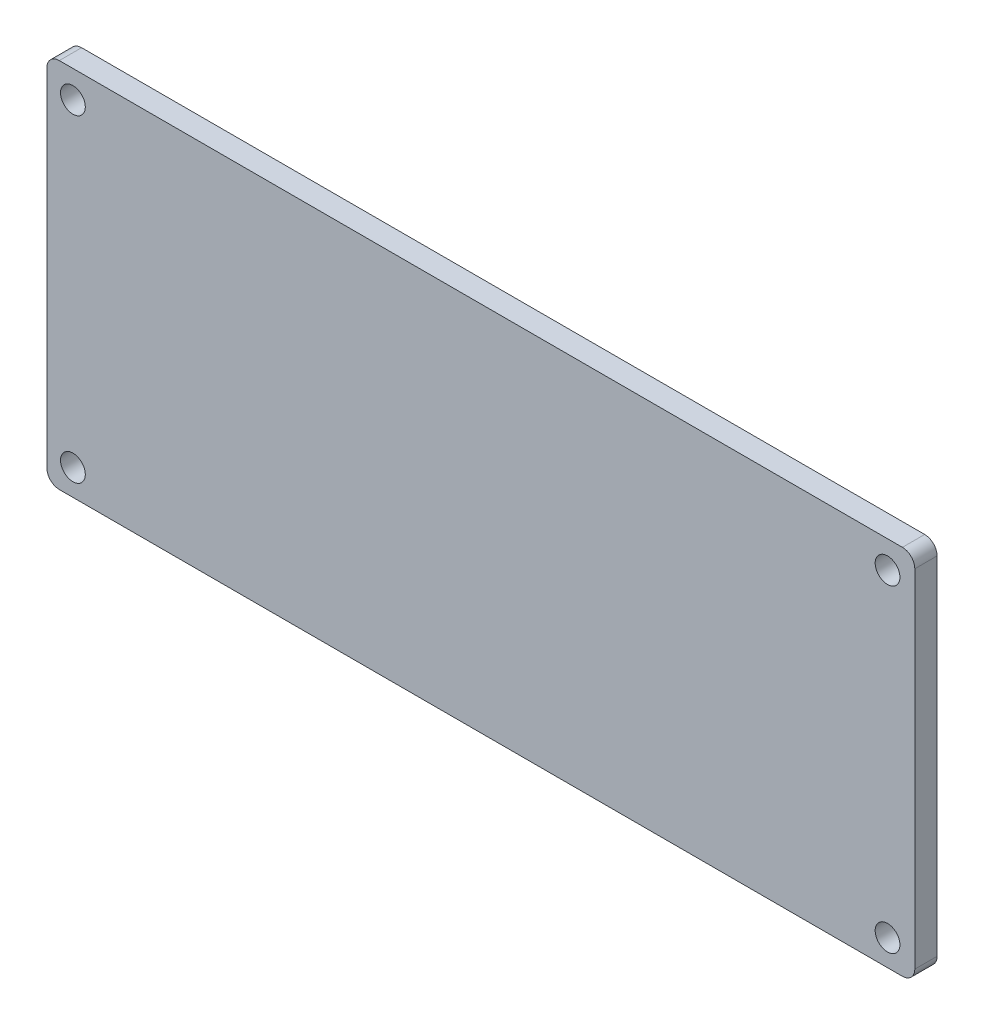
ISO-10303-21;
HEADER;
FILE_DESCRIPTION(('STEP AP214'),'2;1');
FILE_NAME('part.step','',(''),(''),'','','');
FILE_SCHEMA(('AUTOMOTIVE_DESIGN { 1 0 10303 214 1 1 1 1 }'));
ENDSEC;
DATA;
#1=APPLICATION_CONTEXT('core data for automotive mechanical design processes');
#2=APPLICATION_PROTOCOL_DEFINITION('international standard','automotive_design',2000,#1);
#3=PRODUCT_CONTEXT('',#1,'mechanical');
#4=PRODUCT('Part','Part','',(#3));
#5=PRODUCT_RELATED_PRODUCT_CATEGORY('part','',(#4));
#6=PRODUCT_DEFINITION_FORMATION('','',#4);
#7=PRODUCT_DEFINITION_CONTEXT('part definition',#1,'design');
#8=PRODUCT_DEFINITION('design','',#6,#7);
#9=PRODUCT_DEFINITION_SHAPE('','',#8);
#10=(LENGTH_UNIT() NAMED_UNIT(*) SI_UNIT(.MILLI.,.METRE.));
#11=(NAMED_UNIT(*) PLANE_ANGLE_UNIT() SI_UNIT($,.RADIAN.));
#12=(NAMED_UNIT(*) SI_UNIT($,.STERADIAN.) SOLID_ANGLE_UNIT());
#13=UNCERTAINTY_MEASURE_WITH_UNIT(LENGTH_MEASURE(1.E-05),#10,'distance_accuracy_value','');
#14=(GEOMETRIC_REPRESENTATION_CONTEXT(3) GLOBAL_UNCERTAINTY_ASSIGNED_CONTEXT((#13)) GLOBAL_UNIT_ASSIGNED_CONTEXT((#10,
#11,#12)) REPRESENTATION_CONTEXT('',''));
#15=CARTESIAN_POINT('',(0.,0.,0.));
#16=DIRECTION('',(0.,0.,1.));
#17=DIRECTION('',(1.,0.,0.));
#18=AXIS2_PLACEMENT_3D('',#15,#16,#17);
#19=CARTESIAN_POINT('',(-34.4276706059377,23.0560732113145,1.8));
#20=DIRECTION('',(1.,0.,0.));
#21=DIRECTION('',(0.,1.,0.));
#22=AXIS2_PLACEMENT_3D('',#19,#20,#21);
#23=PLANE('',#22);
#24=DIRECTION('',(0.,-1.,0.));
#25=VECTOR('',#24,1.);
#26=CARTESIAN_POINT('',(-34.4276706059377,23.0560732113145,1.8));
#27=LINE('',#26,#25);
#28=CARTESIAN_POINT('',(-34.4276706059377,22.0560732113145,1.8));
#29=VERTEX_POINT('',#28);
#30=CARTESIAN_POINT('',(-34.4276706059377,-5.94392678868552,1.8));
#31=VERTEX_POINT('',#30);
#32=EDGE_CURVE('E117',#29,#31,#27,.T.);
#33=ORIENTED_EDGE('',*,*,#32,.F.);
#34=DIRECTION('',(0.,0.,-1.));
#35=VECTOR('',#34,1.);
#36=CARTESIAN_POINT('',(-34.4276706059377,22.0560732113145,1.8));
#37=LINE('',#36,#35);
#38=CARTESIAN_POINT('',(-34.4276706059377,22.0560732113145,0.));
#39=VERTEX_POINT('',#38);
#40=EDGE_CURVE('E102',#29,#39,#37,.T.);
#41=ORIENTED_EDGE('',*,*,#40,.T.);
#42=DIRECTION('',(0.,-1.,0.));
#43=VECTOR('',#42,1.);
#44=CARTESIAN_POINT('',(-34.4276706059377,23.0560732113145,0.));
#45=LINE('',#44,#43);
#46=CARTESIAN_POINT('',(-34.4276706059377,-5.94392678868552,0.));
#47=VERTEX_POINT('',#46);
#48=EDGE_CURVE('E114',#39,#47,#45,.T.);
#49=ORIENTED_EDGE('',*,*,#48,.T.);
#50=DIRECTION('',(0.,0.,-1.));
#51=VECTOR('',#50,1.);
#52=CARTESIAN_POINT('',(-34.4276706059377,-5.94392678868552,1.8));
#53=LINE('',#52,#51);
#54=EDGE_CURVE('E119',#47,#31,#53,.F.);
#55=ORIENTED_EDGE('',*,*,#54,.T.);
#56=EDGE_LOOP('',(#33,#41,#49,#55));
#57=FACE_BOUND('',#56,.T.);
#58=ADVANCED_FACE('F32',(#57),#23,.F.);
#59=CARTESIAN_POINT('',(-34.4276706059377,-6.94392678868552,1.8));
#60=DIRECTION('',(0.,1.,0.));
#61=DIRECTION('',(0.,0.,1.));
#62=AXIS2_PLACEMENT_3D('',#59,#60,#61);
#63=PLANE('',#62);
#64=DIRECTION('',(1.,0.,0.));
#65=VECTOR('',#64,1.);
#66=CARTESIAN_POINT('',(-34.4276706059377,-6.94392678868552,1.8));
#67=LINE('',#66,#65);
#68=CARTESIAN_POINT('',(-33.4276706059377,-6.94392678868552,1.8));
#69=VERTEX_POINT('',#68);
#70=CARTESIAN_POINT('',(34.6523293940623,-6.94392678868552,1.8));
#71=VERTEX_POINT('',#70);
#72=EDGE_CURVE('E163',#69,#71,#67,.T.);
#73=ORIENTED_EDGE('',*,*,#72,.F.);
#74=DIRECTION('',(0.,0.,-1.));
#75=VECTOR('',#74,1.);
#76=CARTESIAN_POINT('',(-33.4276706059377,-6.94392678868552,1.8));
#77=LINE('',#76,#75);
#78=CARTESIAN_POINT('',(-33.4276706059377,-6.94392678868552,0.));
#79=VERTEX_POINT('',#78);
#80=EDGE_CURVE('E156',#69,#79,#77,.T.);
#81=ORIENTED_EDGE('',*,*,#80,.T.);
#82=DIRECTION('',(1.,0.,0.));
#83=VECTOR('',#82,1.);
#84=CARTESIAN_POINT('',(-34.4276706059377,-6.94392678868552,0.));
#85=LINE('',#84,#83);
#86=CARTESIAN_POINT('',(34.6523293940623,-6.94392678868552,0.));
#87=VERTEX_POINT('',#86);
#88=EDGE_CURVE('E123',#79,#87,#85,.T.);
#89=ORIENTED_EDGE('',*,*,#88,.T.);
#90=DIRECTION('',(0.,0.,-1.));
#91=VECTOR('',#90,1.);
#92=CARTESIAN_POINT('',(34.6523293940623,-6.94392678868552,1.8));
#93=LINE('',#92,#91);
#94=EDGE_CURVE('E154',#87,#71,#93,.F.);
#95=ORIENTED_EDGE('',*,*,#94,.T.);
#96=EDGE_LOOP('',(#73,#81,#89,#95));
#97=FACE_BOUND('',#96,.T.);
#98=ADVANCED_FACE('F161',(#97),#63,.F.);
#99=CARTESIAN_POINT('',(35.6523293940623,23.0560732113145,1.8));
#100=DIRECTION('',(-1.,0.,0.));
#101=DIRECTION('',(0.,-1.,0.));
#102=AXIS2_PLACEMENT_3D('',#99,#100,#101);
#103=PLANE('',#102);
#104=DIRECTION('',(0.,1.,0.));
#105=VECTOR('',#104,1.);
#106=CARTESIAN_POINT('',(35.6523293940623,23.0560732113145,1.8));
#107=LINE('',#106,#105);
#108=CARTESIAN_POINT('',(35.6523293940623,-5.94392678868552,1.8));
#109=VERTEX_POINT('',#108);
#110=CARTESIAN_POINT('',(35.6523293940623,22.0560732113145,1.8));
#111=VERTEX_POINT('',#110);
#112=EDGE_CURVE('E171',#109,#111,#107,.T.);
#113=ORIENTED_EDGE('',*,*,#112,.F.);
#114=DIRECTION('',(0.,0.,-1.));
#115=VECTOR('',#114,1.);
#116=CARTESIAN_POINT('',(35.6523293940623,-5.94392678868552,1.8));
#117=LINE('',#116,#115);
#118=CARTESIAN_POINT('',(35.6523293940623,-5.94392678868552,0.));
#119=VERTEX_POINT('',#118);
#120=EDGE_CURVE('E11',#109,#119,#117,.T.);
#121=ORIENTED_EDGE('',*,*,#120,.T.);
#122=DIRECTION('',(0.,1.,0.));
#123=VECTOR('',#122,1.);
#124=CARTESIAN_POINT('',(35.6523293940623,23.0560732113145,0.));
#125=LINE('',#124,#123);
#126=CARTESIAN_POINT('',(35.6523293940623,22.0560732113145,0.));
#127=VERTEX_POINT('',#126);
#128=EDGE_CURVE('E127',#119,#127,#125,.T.);
#129=ORIENTED_EDGE('',*,*,#128,.T.);
#130=DIRECTION('',(0.,0.,-1.));
#131=VECTOR('',#130,1.);
#132=CARTESIAN_POINT('',(35.6523293940623,22.0560732113145,1.8));
#133=LINE('',#132,#131);
#134=EDGE_CURVE('E40',#127,#111,#133,.F.);
#135=ORIENTED_EDGE('',*,*,#134,.T.);
#136=EDGE_LOOP('',(#113,#121,#129,#135));
#137=FACE_BOUND('',#136,.T.);
#138=ADVANCED_FACE('F170',(#137),#103,.F.);
#139=CARTESIAN_POINT('',(-34.4276706059377,23.0560732113145,1.8));
#140=DIRECTION('',(0.,-1.,0.));
#141=DIRECTION('',(0.,0.,-1.));
#142=AXIS2_PLACEMENT_3D('',#139,#140,#141);
#143=PLANE('',#142);
#144=DIRECTION('',(-1.,0.,0.));
#145=VECTOR('',#144,1.);
#146=CARTESIAN_POINT('',(-34.4276706059377,23.0560732113145,0.));
#147=LINE('',#146,#145);
#148=CARTESIAN_POINT('',(34.6523293940623,23.0560732113145,0.));
#149=VERTEX_POINT('',#148);
#150=CARTESIAN_POINT('',(-33.4276706059377,23.0560732113145,0.));
#151=VERTEX_POINT('',#150);
#152=EDGE_CURVE('E137',#149,#151,#147,.T.);
#153=ORIENTED_EDGE('',*,*,#152,.T.);
#154=DIRECTION('',(0.,0.,-1.));
#155=VECTOR('',#154,1.);
#156=CARTESIAN_POINT('',(-33.4276706059377,23.0560732113145,1.8));
#157=LINE('',#156,#155);
#158=CARTESIAN_POINT('',(-33.4276706059377,23.0560732113145,1.8));
#159=VERTEX_POINT('',#158);
#160=EDGE_CURVE('E103',#151,#159,#157,.F.);
#161=ORIENTED_EDGE('',*,*,#160,.T.);
#162=DIRECTION('',(-1.,0.,0.));
#163=VECTOR('',#162,1.);
#164=CARTESIAN_POINT('',(-34.4276706059377,23.0560732113145,1.8));
#165=LINE('',#164,#163);
#166=CARTESIAN_POINT('',(34.6523293940623,23.0560732113145,1.8));
#167=VERTEX_POINT('',#166);
#168=EDGE_CURVE('E133',#167,#159,#165,.T.);
#169=ORIENTED_EDGE('',*,*,#168,.F.);
#170=DIRECTION('',(0.,0.,-1.));
#171=VECTOR('',#170,1.);
#172=CARTESIAN_POINT('',(34.6523293940623,23.0560732113145,1.8));
#173=LINE('',#172,#171);
#174=EDGE_CURVE('E108',#167,#149,#173,.T.);
#175=ORIENTED_EDGE('',*,*,#174,.T.);
#176=EDGE_LOOP('',(#153,#161,#169,#175));
#177=FACE_BOUND('',#176,.T.);
#178=ADVANCED_FACE('F211',(#177),#143,.F.);
#179=CARTESIAN_POINT('',(0.,0.,1.8));
#180=DIRECTION('',(0.,0.,1.));
#181=DIRECTION('',(1.,0.,0.));
#182=AXIS2_PLACEMENT_3D('',#179,#180,#181);
#183=PLANE('',#182);
#184=CARTESIAN_POINT('',(33.4523293940623,20.8560732113145,1.8));
#185=DIRECTION('',(0.,0.,1.));
#186=DIRECTION('',(1.,0.,0.));
#187=AXIS2_PLACEMENT_3D('',#184,#185,#186);
#188=CIRCLE('',#187,0.999999999999998);
#189=CARTESIAN_POINT('',(34.4523293940623,20.8560732113145,1.8));
#190=VERTEX_POINT('',#189);
#191=EDGE_CURVE('E180',#190,#190,#188,.T.);
#192=ORIENTED_EDGE('',*,*,#191,.F.);
#193=EDGE_LOOP('',(#192));
#194=FACE_BOUND('',#193,.T.);
#195=CARTESIAN_POINT('',(33.4523293940623,-4.84392678868552,1.8));
#196=DIRECTION('',(0.,0.,1.));
#197=DIRECTION('',(1.,0.,0.));
#198=AXIS2_PLACEMENT_3D('',#195,#196,#197);
#199=CIRCLE('',#198,0.999999999999998);
#200=CARTESIAN_POINT('',(34.4523293940623,-4.84392678868552,1.8));
#201=VERTEX_POINT('',#200);
#202=EDGE_CURVE('E186',#201,#201,#199,.T.);
#203=ORIENTED_EDGE('',*,*,#202,.F.);
#204=EDGE_LOOP('',(#203));
#205=FACE_BOUND('',#204,.T.);
#206=CARTESIAN_POINT('',(-32.3276706059377,-4.84392678868552,1.8));
#207=DIRECTION('',(0.,0.,1.));
#208=DIRECTION('',(1.,0.,0.));
#209=AXIS2_PLACEMENT_3D('',#206,#207,#208);
#210=CIRCLE('',#209,0.999999999999998);
#211=CARTESIAN_POINT('',(-31.3276706059377,-4.84392678868552,1.8));
#212=VERTEX_POINT('',#211);
#213=EDGE_CURVE('E192',#212,#212,#210,.T.);
#214=ORIENTED_EDGE('',*,*,#213,.F.);
#215=EDGE_LOOP('',(#214));
#216=FACE_BOUND('',#215,.T.);
#217=CARTESIAN_POINT('',(-32.3276706059377,20.8560732113145,1.8));
#218=DIRECTION('',(0.,0.,1.));
#219=DIRECTION('',(1.,0.,0.));
#220=AXIS2_PLACEMENT_3D('',#217,#218,#219);
#221=CIRCLE('',#220,0.999999999999998);
#222=CARTESIAN_POINT('',(-31.3276706059377,20.8560732113145,1.8));
#223=VERTEX_POINT('',#222);
#224=EDGE_CURVE('E130',#223,#223,#221,.T.);
#225=ORIENTED_EDGE('',*,*,#224,.F.);
#226=EDGE_LOOP('',(#225));
#227=FACE_BOUND('',#226,.T.);
#228=ORIENTED_EDGE('',*,*,#168,.T.);
#229=CARTESIAN_POINT('',(-33.4276706059377,22.0560732113145,1.8));
#230=DIRECTION('',(0.,0.,1.));
#231=DIRECTION('',(1.,0.,0.));
#232=AXIS2_PLACEMENT_3D('',#229,#230,#231);
#233=CIRCLE('',#232,1.);
#234=EDGE_CURVE('E152',#159,#29,#233,.T.);
#235=ORIENTED_EDGE('',*,*,#234,.T.);
#236=ORIENTED_EDGE('',*,*,#32,.T.);
#237=CARTESIAN_POINT('',(-33.4276706059377,-5.94392678868552,1.8));
#238=DIRECTION('',(0.,0.,1.));
#239=DIRECTION('',(1.,0.,0.));
#240=AXIS2_PLACEMENT_3D('',#237,#238,#239);
#241=CIRCLE('',#240,1.);
#242=EDGE_CURVE('E150',#31,#69,#241,.T.);
#243=ORIENTED_EDGE('',*,*,#242,.T.);
#244=ORIENTED_EDGE('',*,*,#72,.T.);
#245=CARTESIAN_POINT('',(34.6523293940623,-5.94392678868552,1.8));
#246=DIRECTION('',(0.,0.,1.));
#247=DIRECTION('',(1.,0.,0.));
#248=AXIS2_PLACEMENT_3D('',#245,#246,#247);
#249=CIRCLE('',#248,1.);
#250=EDGE_CURVE('E53',#71,#109,#249,.T.);
#251=ORIENTED_EDGE('',*,*,#250,.T.);
#252=ORIENTED_EDGE('',*,*,#112,.T.);
#253=CARTESIAN_POINT('',(34.6523293940623,22.0560732113145,1.8));
#254=DIRECTION('',(0.,0.,1.));
#255=DIRECTION('',(1.,0.,0.));
#256=AXIS2_PLACEMENT_3D('',#253,#254,#255);
#257=CIRCLE('',#256,1.);
#258=EDGE_CURVE('E147',#111,#167,#257,.T.);
#259=ORIENTED_EDGE('',*,*,#258,.T.);
#260=EDGE_LOOP('',(#228,#235,#236,#243,#244,#251,#252,#259));
#261=FACE_BOUND('',#260,.T.);
#262=ADVANCED_FACE('F208',(#194,#205,#216,#227,#261),#183,.T.);
#263=CARTESIAN_POINT('',(0.,0.,0.));
#264=DIRECTION('',(0.,0.,1.));
#265=DIRECTION('',(1.,0.,0.));
#266=AXIS2_PLACEMENT_3D('',#263,#264,#265);
#267=PLANE('',#266);
#268=CARTESIAN_POINT('',(33.4523293940623,20.8560732113145,0.));
#269=DIRECTION('',(0.,0.,1.));
#270=DIRECTION('',(1.,0.,0.));
#271=AXIS2_PLACEMENT_3D('',#268,#269,#270);
#272=CIRCLE('',#271,0.999999999999998);
#273=CARTESIAN_POINT('',(34.4523293940623,20.8560732113145,0.));
#274=VERTEX_POINT('',#273);
#275=EDGE_CURVE('E183',#274,#274,#272,.T.);
#276=ORIENTED_EDGE('',*,*,#275,.T.);
#277=EDGE_LOOP('',(#276));
#278=FACE_BOUND('',#277,.T.);
#279=CARTESIAN_POINT('',(33.4523293940623,-4.84392678868552,0.));
#280=DIRECTION('',(0.,0.,1.));
#281=DIRECTION('',(1.,0.,0.));
#282=AXIS2_PLACEMENT_3D('',#279,#280,#281);
#283=CIRCLE('',#282,0.999999999999998);
#284=CARTESIAN_POINT('',(34.4523293940623,-4.84392678868552,0.));
#285=VERTEX_POINT('',#284);
#286=EDGE_CURVE('E189',#285,#285,#283,.T.);
#287=ORIENTED_EDGE('',*,*,#286,.T.);
#288=EDGE_LOOP('',(#287));
#289=FACE_BOUND('',#288,.T.);
#290=CARTESIAN_POINT('',(-32.3276706059377,-4.84392678868552,0.));
#291=DIRECTION('',(0.,0.,1.));
#292=DIRECTION('',(1.,0.,0.));
#293=AXIS2_PLACEMENT_3D('',#290,#291,#292);
#294=CIRCLE('',#293,0.999999999999998);
#295=CARTESIAN_POINT('',(-31.3276706059377,-4.84392678868552,0.));
#296=VERTEX_POINT('',#295);
#297=EDGE_CURVE('E178',#296,#296,#294,.T.);
#298=ORIENTED_EDGE('',*,*,#297,.T.);
#299=EDGE_LOOP('',(#298));
#300=FACE_BOUND('',#299,.T.);
#301=CARTESIAN_POINT('',(-32.3276706059377,20.8560732113145,0.));
#302=DIRECTION('',(0.,0.,1.));
#303=DIRECTION('',(1.,0.,0.));
#304=AXIS2_PLACEMENT_3D('',#301,#302,#303);
#305=CIRCLE('',#304,0.999999999999998);
#306=CARTESIAN_POINT('',(-31.3276706059377,20.8560732113145,0.));
#307=VERTEX_POINT('',#306);
#308=EDGE_CURVE('E124',#307,#307,#305,.T.);
#309=ORIENTED_EDGE('',*,*,#308,.T.);
#310=EDGE_LOOP('',(#309));
#311=FACE_BOUND('',#310,.T.);
#312=ORIENTED_EDGE('',*,*,#48,.F.);
#313=CARTESIAN_POINT('',(-33.4276706059377,22.0560732113145,0.));
#314=DIRECTION('',(0.,0.,1.));
#315=DIRECTION('',(1.,0.,0.));
#316=AXIS2_PLACEMENT_3D('',#313,#314,#315);
#317=CIRCLE('',#316,1.);
#318=EDGE_CURVE('E98',#39,#151,#317,.F.);
#319=ORIENTED_EDGE('',*,*,#318,.T.);
#320=ORIENTED_EDGE('',*,*,#152,.F.);
#321=CARTESIAN_POINT('',(34.6523293940623,22.0560732113145,0.));
#322=DIRECTION('',(0.,0.,1.));
#323=DIRECTION('',(1.,0.,0.));
#324=AXIS2_PLACEMENT_3D('',#321,#322,#323);
#325=CIRCLE('',#324,1.);
#326=EDGE_CURVE('E118',#149,#127,#325,.F.);
#327=ORIENTED_EDGE('',*,*,#326,.T.);
#328=ORIENTED_EDGE('',*,*,#128,.F.);
#329=CARTESIAN_POINT('',(34.6523293940623,-5.94392678868552,0.));
#330=DIRECTION('',(0.,0.,1.));
#331=DIRECTION('',(1.,0.,0.));
#332=AXIS2_PLACEMENT_3D('',#329,#330,#331);
#333=CIRCLE('',#332,1.);
#334=EDGE_CURVE('E141',#119,#87,#333,.F.);
#335=ORIENTED_EDGE('',*,*,#334,.T.);
#336=ORIENTED_EDGE('',*,*,#88,.F.);
#337=CARTESIAN_POINT('',(-33.4276706059377,-5.94392678868552,0.));
#338=DIRECTION('',(0.,0.,1.));
#339=DIRECTION('',(1.,0.,0.));
#340=AXIS2_PLACEMENT_3D('',#337,#338,#339);
#341=CIRCLE('',#340,1.);
#342=EDGE_CURVE('E109',#79,#47,#341,.F.);
#343=ORIENTED_EDGE('',*,*,#342,.T.);
#344=EDGE_LOOP('',(#312,#319,#320,#327,#328,#335,#336,#343));
#345=FACE_BOUND('',#344,.T.);
#346=ADVANCED_FACE('F121',(#278,#289,#300,#311,#345),#267,.F.);
#347=CARTESIAN_POINT('',(-33.4276706059377,22.0560732113145,1.8));
#348=DIRECTION('',(0.,0.,-1.));
#349=DIRECTION('',(-1.,0.,0.));
#350=AXIS2_PLACEMENT_3D('',#347,#348,#349);
#351=CYLINDRICAL_SURFACE('',#350,1.);
#352=ORIENTED_EDGE('',*,*,#234,.F.);
#353=ORIENTED_EDGE('',*,*,#160,.F.);
#354=ORIENTED_EDGE('',*,*,#318,.F.);
#355=ORIENTED_EDGE('',*,*,#40,.F.);
#356=EDGE_LOOP('',(#352,#353,#354,#355));
#357=FACE_BOUND('',#356,.T.);
#358=ADVANCED_FACE('F101',(#357),#351,.T.);
#359=CARTESIAN_POINT('',(-33.4276706059377,-5.94392678868552,1.8));
#360=DIRECTION('',(0.,0.,-1.));
#361=DIRECTION('',(-1.,0.,0.));
#362=AXIS2_PLACEMENT_3D('',#359,#360,#361);
#363=CYLINDRICAL_SURFACE('',#362,1.);
#364=ORIENTED_EDGE('',*,*,#242,.F.);
#365=ORIENTED_EDGE('',*,*,#54,.F.);
#366=ORIENTED_EDGE('',*,*,#342,.F.);
#367=ORIENTED_EDGE('',*,*,#80,.F.);
#368=EDGE_LOOP('',(#364,#365,#366,#367));
#369=FACE_BOUND('',#368,.T.);
#370=ADVANCED_FACE('F226',(#369),#363,.T.);
#371=CARTESIAN_POINT('',(34.6523293940623,-5.94392678868552,1.8));
#372=DIRECTION('',(0.,0.,-1.));
#373=DIRECTION('',(-1.,0.,0.));
#374=AXIS2_PLACEMENT_3D('',#371,#372,#373);
#375=CYLINDRICAL_SURFACE('',#374,1.);
#376=ORIENTED_EDGE('',*,*,#250,.F.);
#377=ORIENTED_EDGE('',*,*,#94,.F.);
#378=ORIENTED_EDGE('',*,*,#334,.F.);
#379=ORIENTED_EDGE('',*,*,#120,.F.);
#380=EDGE_LOOP('',(#376,#377,#378,#379));
#381=FACE_BOUND('',#380,.T.);
#382=ADVANCED_FACE('F169',(#381),#375,.T.);
#383=CARTESIAN_POINT('',(34.6523293940623,22.0560732113145,1.8));
#384=DIRECTION('',(0.,0.,-1.));
#385=DIRECTION('',(-1.,0.,0.));
#386=AXIS2_PLACEMENT_3D('',#383,#384,#385);
#387=CYLINDRICAL_SURFACE('',#386,1.);
#388=ORIENTED_EDGE('',*,*,#258,.F.);
#389=ORIENTED_EDGE('',*,*,#134,.F.);
#390=ORIENTED_EDGE('',*,*,#326,.F.);
#391=ORIENTED_EDGE('',*,*,#174,.F.);
#392=EDGE_LOOP('',(#388,#389,#390,#391));
#393=FACE_BOUND('',#392,.T.);
#394=ADVANCED_FACE('F34',(#393),#387,.T.);
#395=CARTESIAN_POINT('',(-32.3276706059377,20.8560732113145,0.));
#396=DIRECTION('',(0.,0.,1.));
#397=DIRECTION('',(1.,0.,0.));
#398=AXIS2_PLACEMENT_3D('',#395,#396,#397);
#399=CYLINDRICAL_SURFACE('',#398,0.999999999999998);
#400=ORIENTED_EDGE('',*,*,#308,.F.);
#401=EDGE_LOOP('',(#400));
#402=FACE_BOUND('',#401,.T.);
#403=ORIENTED_EDGE('',*,*,#224,.T.);
#404=EDGE_LOOP('',(#403));
#405=FACE_BOUND('',#404,.T.);
#406=ADVANCED_FACE('F204',(#402,#405),#399,.F.);
#407=CARTESIAN_POINT('',(-32.3276706059377,-4.84392678868552,0.));
#408=DIRECTION('',(0.,0.,1.));
#409=DIRECTION('',(1.,0.,0.));
#410=AXIS2_PLACEMENT_3D('',#407,#408,#409);
#411=CYLINDRICAL_SURFACE('',#410,0.999999999999998);
#412=ORIENTED_EDGE('',*,*,#297,.F.);
#413=EDGE_LOOP('',(#412));
#414=FACE_BOUND('',#413,.T.);
#415=ORIENTED_EDGE('',*,*,#213,.T.);
#416=EDGE_LOOP('',(#415));
#417=FACE_BOUND('',#416,.T.);
#418=ADVANCED_FACE('F200',(#414,#417),#411,.F.);
#419=CARTESIAN_POINT('',(33.4523293940623,-4.84392678868552,0.));
#420=DIRECTION('',(0.,0.,1.));
#421=DIRECTION('',(1.,0.,0.));
#422=AXIS2_PLACEMENT_3D('',#419,#420,#421);
#423=CYLINDRICAL_SURFACE('',#422,0.999999999999998);
#424=ORIENTED_EDGE('',*,*,#286,.F.);
#425=EDGE_LOOP('',(#424));
#426=FACE_BOUND('',#425,.T.);
#427=ORIENTED_EDGE('',*,*,#202,.T.);
#428=EDGE_LOOP('',(#427));
#429=FACE_BOUND('',#428,.T.);
#430=ADVANCED_FACE('F203',(#426,#429),#423,.F.);
#431=CARTESIAN_POINT('',(33.4523293940623,20.8560732113145,0.));
#432=DIRECTION('',(0.,0.,1.));
#433=DIRECTION('',(1.,0.,0.));
#434=AXIS2_PLACEMENT_3D('',#431,#432,#433);
#435=CYLINDRICAL_SURFACE('',#434,0.999999999999998);
#436=ORIENTED_EDGE('',*,*,#275,.F.);
#437=EDGE_LOOP('',(#436));
#438=FACE_BOUND('',#437,.T.);
#439=ORIENTED_EDGE('',*,*,#191,.T.);
#440=EDGE_LOOP('',(#439));
#441=FACE_BOUND('',#440,.T.);
#442=ADVANCED_FACE('F289',(#438,#441),#435,.F.);
#443=CLOSED_SHELL('',(#58,#98,#138,#178,#262,#346,#358,#370,#382,#394,#406,#418,#430,#442));
#444=MANIFOLD_SOLID_BREP('B2',#443);
#445=ADVANCED_BREP_SHAPE_REPRESENTATION('',(#18,#444),#14);
#446=SHAPE_DEFINITION_REPRESENTATION(#9,#445);
ENDSEC;
END-ISO-10303-21;
